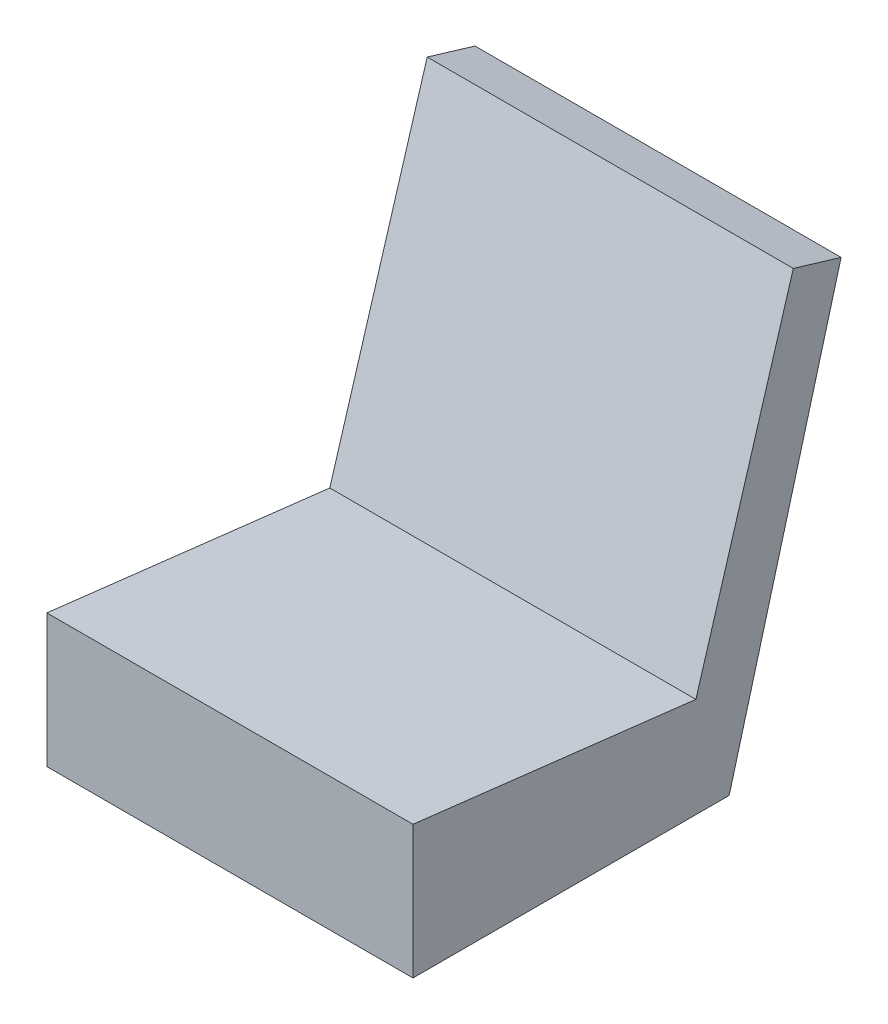
ISO-10303-21;
HEADER;
FILE_DESCRIPTION(('STEP AP214'),'2;1');
FILE_NAME('part.step','',(''),(''),'','','');
FILE_SCHEMA(('AUTOMOTIVE_DESIGN { 1 0 10303 214 1 1 1 1 }'));
ENDSEC;
DATA;
#1=APPLICATION_CONTEXT('core data for automotive mechanical design processes');
#2=APPLICATION_PROTOCOL_DEFINITION('international standard','automotive_design',2000,#1);
#3=PRODUCT_CONTEXT('',#1,'mechanical');
#4=PRODUCT('Part','Part','',(#3));
#5=PRODUCT_RELATED_PRODUCT_CATEGORY('part','',(#4));
#6=PRODUCT_DEFINITION_FORMATION('','',#4);
#7=PRODUCT_DEFINITION_CONTEXT('part definition',#1,'design');
#8=PRODUCT_DEFINITION('design','',#6,#7);
#9=PRODUCT_DEFINITION_SHAPE('','',#8);
#10=(LENGTH_UNIT() NAMED_UNIT(*) SI_UNIT(.MILLI.,.METRE.));
#11=(NAMED_UNIT(*) PLANE_ANGLE_UNIT() SI_UNIT($,.RADIAN.));
#12=(NAMED_UNIT(*) SI_UNIT($,.STERADIAN.) SOLID_ANGLE_UNIT());
#13=UNCERTAINTY_MEASURE_WITH_UNIT(LENGTH_MEASURE(1.E-05),#10,'distance_accuracy_value','');
#14=(GEOMETRIC_REPRESENTATION_CONTEXT(3) GLOBAL_UNCERTAINTY_ASSIGNED_CONTEXT((#13)) GLOBAL_UNIT_ASSIGNED_CONTEXT((#10,
#11,#12)) REPRESENTATION_CONTEXT('',''));
#15=CARTESIAN_POINT('',(0.,0.,0.));
#16=DIRECTION('',(0.,0.,1.));
#17=DIRECTION('',(1.,0.,0.));
#18=AXIS2_PLACEMENT_3D('',#15,#16,#17);
#19=CARTESIAN_POINT('',(558.8,625.790598119212,-170.872129127359));
#20=DIRECTION('',(0.,0.263407179433874,0.964684745304232));
#21=DIRECTION('',(0.,-0.964684745304232,0.263407179433874));
#22=AXIS2_PLACEMENT_3D('',#19,#20,#21);
#23=PLANE('',#22);
#24=DIRECTION('',(0.,0.964684745304232,-0.263407179433874));
#25=VECTOR('',#24,1.);
#26=CARTESIAN_POINT('',(0.,625.790598119212,-170.872129127359));
#27=LINE('',#26,#25);
#28=CARTESIAN_POINT('',(0.,0.,0.));
#29=VERTEX_POINT('',#28);
#30=CARTESIAN_POINT('',(0.,625.790598119212,-170.872129127359));
#31=VERTEX_POINT('',#30);
#32=EDGE_CURVE('E118',#29,#31,#27,.T.);
#33=ORIENTED_EDGE('',*,*,#32,.T.);
#34=DIRECTION('',(-1.,0.,0.));
#35=VECTOR('',#34,1.);
#36=CARTESIAN_POINT('',(558.8,625.790598119212,-170.872129127359));
#37=LINE('',#36,#35);
#38=CARTESIAN_POINT('',(558.8,625.790598119212,-170.872129127359));
#39=VERTEX_POINT('',#38);
#40=EDGE_CURVE('E11',#39,#31,#37,.T.);
#41=ORIENTED_EDGE('',*,*,#40,.F.);
#42=DIRECTION('',(0.,0.964684745304232,-0.263407179433874));
#43=VECTOR('',#42,1.);
#44=CARTESIAN_POINT('',(558.8,625.790598119212,-170.872129127359));
#45=LINE('',#44,#43);
#46=CARTESIAN_POINT('',(558.8,0.,0.));
#47=VERTEX_POINT('',#46);
#48=EDGE_CURVE('E128',#47,#39,#45,.T.);
#49=ORIENTED_EDGE('',*,*,#48,.F.);
#50=DIRECTION('',(-1.,0.,0.));
#51=VECTOR('',#50,1.);
#52=CARTESIAN_POINT('',(558.8,0.,0.));
#53=LINE('',#52,#51);
#54=EDGE_CURVE('E114',#47,#29,#53,.T.);
#55=ORIENTED_EDGE('',*,*,#54,.T.);
#56=EDGE_LOOP('',(#33,#41,#49,#55));
#57=FACE_BOUND('',#56,.T.);
#58=ADVANCED_FACE('F34',(#57),#23,.F.);
#59=CARTESIAN_POINT('',(558.8,647.7,-97.88981545325));
#60=DIRECTION('',(0.,-0.957773145329521,0.287524959065464));
#61=DIRECTION('',(0.,-0.287524959065464,-0.957773145329521));
#62=AXIS2_PLACEMENT_3D('',#59,#60,#61);
#63=PLANE('',#62);
#64=DIRECTION('',(0.,0.287524959065464,0.957773145329521));
#65=VECTOR('',#64,1.);
#66=CARTESIAN_POINT('',(0.,647.7,-97.88981545325));
#67=LINE('',#66,#65);
#68=CARTESIAN_POINT('',(0.,647.7,-97.88981545325));
#69=VERTEX_POINT('',#68);
#70=EDGE_CURVE('E121',#31,#69,#67,.T.);
#71=ORIENTED_EDGE('',*,*,#70,.T.);
#72=DIRECTION('',(-1.,0.,0.));
#73=VECTOR('',#72,1.);
#74=CARTESIAN_POINT('',(558.8,647.7,-97.88981545325));
#75=LINE('',#74,#73);
#76=CARTESIAN_POINT('',(558.8,647.7,-97.88981545325));
#77=VERTEX_POINT('',#76);
#78=EDGE_CURVE('E42',#77,#69,#75,.T.);
#79=ORIENTED_EDGE('',*,*,#78,.F.);
#80=DIRECTION('',(0.,0.287524959065464,0.957773145329521));
#81=VECTOR('',#80,1.);
#82=CARTESIAN_POINT('',(558.8,647.7,-97.88981545325));
#83=LINE('',#82,#81);
#84=EDGE_CURVE('E87',#39,#77,#83,.T.);
#85=ORIENTED_EDGE('',*,*,#84,.F.);
#86=ORIENTED_EDGE('',*,*,#40,.T.);
#87=EDGE_LOOP('',(#71,#79,#85,#86));
#88=FACE_BOUND('',#87,.T.);
#89=ADVANCED_FACE('F152',(#88),#63,.F.);
#90=CARTESIAN_POINT('',(558.8,152.4,50.8));
#91=DIRECTION('',(0.,-0.287524959065466,-0.95777314532952));
#92=DIRECTION('',(0.,0.95777314532952,-0.287524959065466));
#93=AXIS2_PLACEMENT_3D('',#90,#91,#92);
#94=PLANE('',#93);
#95=DIRECTION('',(0.,-0.95777314532952,0.287524959065466));
#96=VECTOR('',#95,1.);
#97=CARTESIAN_POINT('',(0.,152.4,50.8));
#98=LINE('',#97,#96);
#99=CARTESIAN_POINT('',(0.,152.4,50.8));
#100=VERTEX_POINT('',#99);
#101=EDGE_CURVE('E123',#69,#100,#98,.T.);
#102=ORIENTED_EDGE('',*,*,#101,.T.);
#103=DIRECTION('',(-1.,0.,0.));
#104=VECTOR('',#103,1.);
#105=CARTESIAN_POINT('',(558.8,152.4,50.8));
#106=LINE('',#105,#104);
#107=CARTESIAN_POINT('',(558.8,152.4,50.8));
#108=VERTEX_POINT('',#107);
#109=EDGE_CURVE('E109',#108,#100,#106,.T.);
#110=ORIENTED_EDGE('',*,*,#109,.F.);
#111=DIRECTION('',(0.,-0.95777314532952,0.287524959065466));
#112=VECTOR('',#111,1.);
#113=CARTESIAN_POINT('',(558.8,152.4,50.8));
#114=LINE('',#113,#112);
#115=EDGE_CURVE('E100',#77,#108,#114,.T.);
#116=ORIENTED_EDGE('',*,*,#115,.F.);
#117=ORIENTED_EDGE('',*,*,#78,.T.);
#118=EDGE_LOOP('',(#102,#110,#116,#117));
#119=FACE_BOUND('',#118,.T.);
#120=ADVANCED_FACE('F134',(#119),#94,.F.);
#121=CARTESIAN_POINT('',(558.8,203.2,482.6));
#122=DIRECTION('',(0.,-0.993150604322876,0.116841247567397));
#123=DIRECTION('',(0.,-0.116841247567397,-0.993150604322876));
#124=AXIS2_PLACEMENT_3D('',#121,#122,#123);
#125=PLANE('',#124);
#126=DIRECTION('',(0.,0.116841247567397,0.993150604322876));
#127=VECTOR('',#126,1.);
#128=CARTESIAN_POINT('',(0.,203.2,482.6));
#129=LINE('',#128,#127);
#130=CARTESIAN_POINT('',(0.,203.2,482.6));
#131=VERTEX_POINT('',#130);
#132=EDGE_CURVE('E108',#100,#131,#129,.T.);
#133=ORIENTED_EDGE('',*,*,#132,.T.);
#134=DIRECTION('',(-1.,0.,0.));
#135=VECTOR('',#134,1.);
#136=CARTESIAN_POINT('',(558.8,203.2,482.6));
#137=LINE('',#136,#135);
#138=CARTESIAN_POINT('',(558.8,203.2,482.6));
#139=VERTEX_POINT('',#138);
#140=EDGE_CURVE('E105',#139,#131,#137,.T.);
#141=ORIENTED_EDGE('',*,*,#140,.F.);
#142=DIRECTION('',(0.,0.116841247567397,0.993150604322876));
#143=VECTOR('',#142,1.);
#144=CARTESIAN_POINT('',(558.8,203.2,482.6));
#145=LINE('',#144,#143);
#146=EDGE_CURVE('E94',#108,#139,#145,.T.);
#147=ORIENTED_EDGE('',*,*,#146,.F.);
#148=ORIENTED_EDGE('',*,*,#109,.T.);
#149=EDGE_LOOP('',(#133,#141,#147,#148));
#150=FACE_BOUND('',#149,.T.);
#151=ADVANCED_FACE('F106',(#150),#125,.F.);
#152=CARTESIAN_POINT('',(558.8,0.,482.6));
#153=DIRECTION('',(0.,0.,-1.));
#154=DIRECTION('',(-1.,0.,0.));
#155=AXIS2_PLACEMENT_3D('',#152,#153,#154);
#156=PLANE('',#155);
#157=DIRECTION('',(0.,-1.,0.));
#158=VECTOR('',#157,1.);
#159=CARTESIAN_POINT('',(0.,0.,482.6));
#160=LINE('',#159,#158);
#161=CARTESIAN_POINT('',(0.,0.,482.6));
#162=VERTEX_POINT('',#161);
#163=EDGE_CURVE('E73',#131,#162,#160,.T.);
#164=ORIENTED_EDGE('',*,*,#163,.T.);
#165=DIRECTION('',(-1.,0.,0.));
#166=VECTOR('',#165,1.);
#167=CARTESIAN_POINT('',(558.8,0.,482.6));
#168=LINE('',#167,#166);
#169=CARTESIAN_POINT('',(558.8,0.,482.6));
#170=VERTEX_POINT('',#169);
#171=EDGE_CURVE('E110',#170,#162,#168,.T.);
#172=ORIENTED_EDGE('',*,*,#171,.F.);
#173=DIRECTION('',(0.,-1.,0.));
#174=VECTOR('',#173,1.);
#175=CARTESIAN_POINT('',(558.8,0.,482.6));
#176=LINE('',#175,#174);
#177=EDGE_CURVE('E98',#139,#170,#176,.T.);
#178=ORIENTED_EDGE('',*,*,#177,.F.);
#179=ORIENTED_EDGE('',*,*,#140,.T.);
#180=EDGE_LOOP('',(#164,#172,#178,#179));
#181=FACE_BOUND('',#180,.T.);
#182=ADVANCED_FACE('F112',(#181),#156,.F.);
#183=CARTESIAN_POINT('',(558.8,0.,0.));
#184=DIRECTION('',(0.,1.,0.));
#185=DIRECTION('',(0.,0.,1.));
#186=AXIS2_PLACEMENT_3D('',#183,#184,#185);
#187=PLANE('',#186);
#188=DIRECTION('',(0.,0.,-1.));
#189=VECTOR('',#188,1.);
#190=CARTESIAN_POINT('',(0.,0.,0.));
#191=LINE('',#190,#189);
#192=EDGE_CURVE('E79',#162,#29,#191,.T.);
#193=ORIENTED_EDGE('',*,*,#192,.T.);
#194=ORIENTED_EDGE('',*,*,#54,.F.);
#195=DIRECTION('',(0.,0.,-1.));
#196=VECTOR('',#195,1.);
#197=CARTESIAN_POINT('',(558.8,0.,0.));
#198=LINE('',#197,#196);
#199=EDGE_CURVE('E50',#170,#47,#198,.T.);
#200=ORIENTED_EDGE('',*,*,#199,.F.);
#201=ORIENTED_EDGE('',*,*,#171,.T.);
#202=EDGE_LOOP('',(#193,#194,#200,#201));
#203=FACE_BOUND('',#202,.T.);
#204=ADVANCED_FACE('F141',(#203),#187,.F.);
#205=CARTESIAN_POINT('',(558.8,0.,0.));
#206=DIRECTION('',(1.,0.,0.));
#207=DIRECTION('',(0.,0.,-1.));
#208=AXIS2_PLACEMENT_3D('',#205,#206,#207);
#209=PLANE('',#208);
#210=ORIENTED_EDGE('',*,*,#48,.T.);
#211=ORIENTED_EDGE('',*,*,#84,.T.);
#212=ORIENTED_EDGE('',*,*,#115,.T.);
#213=ORIENTED_EDGE('',*,*,#146,.T.);
#214=ORIENTED_EDGE('',*,*,#177,.T.);
#215=ORIENTED_EDGE('',*,*,#199,.T.);
#216=EDGE_LOOP('',(#210,#211,#212,#213,#214,#215));
#217=FACE_BOUND('',#216,.T.);
#218=ADVANCED_FACE('F96',(#217),#209,.T.);
#219=CARTESIAN_POINT('',(0.,0.,0.));
#220=DIRECTION('',(1.,0.,0.));
#221=DIRECTION('',(0.,0.,-1.));
#222=AXIS2_PLACEMENT_3D('',#219,#220,#221);
#223=PLANE('',#222);
#224=ORIENTED_EDGE('',*,*,#32,.F.);
#225=ORIENTED_EDGE('',*,*,#192,.F.);
#226=ORIENTED_EDGE('',*,*,#163,.F.);
#227=ORIENTED_EDGE('',*,*,#132,.F.);
#228=ORIENTED_EDGE('',*,*,#101,.F.);
#229=ORIENTED_EDGE('',*,*,#70,.F.);
#230=EDGE_LOOP('',(#224,#225,#226,#227,#228,#229));
#231=FACE_BOUND('',#230,.T.);
#232=ADVANCED_FACE('F137',(#231),#223,.F.);
#233=CLOSED_SHELL('',(#58,#89,#120,#151,#182,#204,#218,#232));
#234=MANIFOLD_SOLID_BREP('B2',#233);
#235=ADVANCED_BREP_SHAPE_REPRESENTATION('',(#18,#234),#14);
#236=SHAPE_DEFINITION_REPRESENTATION(#9,#235);
ENDSEC;
END-ISO-10303-21;
